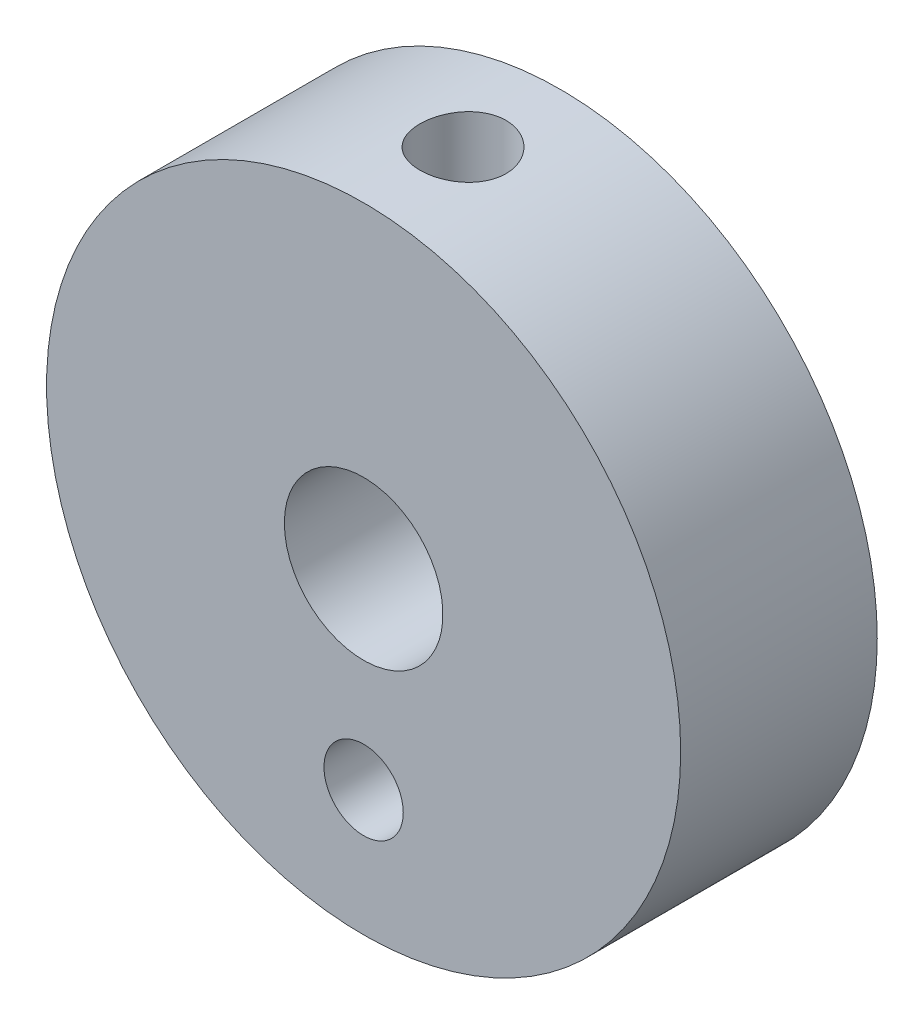
ISO-10303-21;
HEADER;
FILE_DESCRIPTION(('STEP AP214'),'2;1');
FILE_NAME('part.step','',(''),(''),'','','');
FILE_SCHEMA(('AUTOMOTIVE_DESIGN { 1 0 10303 214 1 1 1 1 }'));
ENDSEC;
DATA;
#1=APPLICATION_CONTEXT('core data for automotive mechanical design processes');
#2=APPLICATION_PROTOCOL_DEFINITION('international standard','automotive_design',2000,#1);
#3=PRODUCT_CONTEXT('',#1,'mechanical');
#4=PRODUCT('Part','Part','',(#3));
#5=PRODUCT_RELATED_PRODUCT_CATEGORY('part','',(#4));
#6=PRODUCT_DEFINITION_FORMATION('','',#4);
#7=PRODUCT_DEFINITION_CONTEXT('part definition',#1,'design');
#8=PRODUCT_DEFINITION('design','',#6,#7);
#9=PRODUCT_DEFINITION_SHAPE('','',#8);
#10=(LENGTH_UNIT() NAMED_UNIT(*) SI_UNIT(.MILLI.,.METRE.));
#11=(NAMED_UNIT(*) PLANE_ANGLE_UNIT() SI_UNIT($,.RADIAN.));
#12=(NAMED_UNIT(*) SI_UNIT($,.STERADIAN.) SOLID_ANGLE_UNIT());
#13=UNCERTAINTY_MEASURE_WITH_UNIT(LENGTH_MEASURE(1.E-05),#10,'distance_accuracy_value','');
#14=(GEOMETRIC_REPRESENTATION_CONTEXT(3) GLOBAL_UNCERTAINTY_ASSIGNED_CONTEXT((#13)) GLOBAL_UNIT_ASSIGNED_CONTEXT((#10,
#11,#12)) REPRESENTATION_CONTEXT('',''));
#15=CARTESIAN_POINT('',(0.,0.,0.));
#16=DIRECTION('',(0.,0.,1.));
#17=DIRECTION('',(1.,0.,0.));
#18=AXIS2_PLACEMENT_3D('',#15,#16,#17);
#19=CARTESIAN_POINT('',(0.,0.,7.874));
#20=DIRECTION('',(0.,0.,-1.));
#21=DIRECTION('',(-1.,0.,0.));
#22=AXIS2_PLACEMENT_3D('',#19,#20,#21);
#23=CYLINDRICAL_SURFACE('',#22,12.7);
#24=CARTESIAN_POINT('',(0.,12.7,2.16573090602914));
#25=CARTESIAN_POINT('',(0.0965396792837069,12.6999985598136,2.1657349603756));
#26=CARTESIAN_POINT('',(0.19313788835952,12.6988876348899,2.17385215836913));
#27=CARTESIAN_POINT('',(0.383641262720466,12.6945628171685,2.20610225633445));
#28=CARTESIAN_POINT('',(0.477543594319555,12.6913467904729,2.23025140791655));
#29=CARTESIAN_POINT('',(0.659870109257268,12.6831736989496,2.29383643344624));
#30=CARTESIAN_POINT('',(0.748298119159549,12.6782178667903,2.33326148632091));
#31=CARTESIAN_POINT('',(0.917267596621579,12.6671148562851,2.42625431016371));
#32=CARTESIAN_POINT('',(0.997810305988701,12.6609678659832,2.47981984930653));
#33=CARTESIAN_POINT('',(1.14925956641373,12.6481232134083,2.59994317911567));
#34=CARTESIAN_POINT('',(1.22010770382684,12.6414225724394,2.66657430571954));
#35=CARTESIAN_POINT('',(1.34965322801174,12.6282495418313,2.81077973869787));
#36=CARTESIAN_POINT('',(1.40834996346752,12.6217771644425,2.88835463128445));
#37=CARTESIAN_POINT('',(1.51214837627796,12.6097643971387,3.05263077512112));
#38=CARTESIAN_POINT('',(1.55719454736091,12.6042278518043,3.13936740361257));
#39=CARTESIAN_POINT('',(1.63205856799503,12.5947535676504,3.31926273074592));
#40=CARTESIAN_POINT('',(1.66187709959711,12.5908157572246,3.41242114154193));
#41=CARTESIAN_POINT('',(1.70526018006781,12.5850136530789,3.60190566604219));
#42=CARTESIAN_POINT('',(1.71892398419745,12.5831367024958,3.69820866049101));
#43=CARTESIAN_POINT('',(1.72991702406735,12.5816302489665,3.89175761871598));
#44=CARTESIAN_POINT('',(1.72724703362472,12.582000639552,3.98900353760296));
#45=CARTESIAN_POINT('',(1.70572959794815,12.584935437427,4.18098224821282));
#46=CARTESIAN_POINT('',(1.68699198937114,12.5874849480826,4.27572761096567));
#47=CARTESIAN_POINT('',(1.63404281811619,12.5944674746746,4.46071674221662));
#48=CARTESIAN_POINT('',(1.59983088959654,12.5989005351415,4.55096040423011));
#49=CARTESIAN_POINT('',(1.51678777622072,12.6091673807594,4.72472272345015));
#50=CARTESIAN_POINT('',(1.46790936702765,12.615005678409,4.80821853405631));
#51=CARTESIAN_POINT('',(1.3569544886235,12.6274217841589,4.96586448228241));
#52=CARTESIAN_POINT('',(1.29487730566084,12.633999632243,5.04001411414244));
#53=CARTESIAN_POINT('',(1.15868073022858,12.6472197429356,5.17750000422544));
#54=CARTESIAN_POINT('',(1.08446676266622,12.6538620914367,5.24074260364108));
#55=CARTESIAN_POINT('',(0.926427528459528,12.6664124756693,5.35388824661152));
#56=CARTESIAN_POINT('',(0.842602232141769,12.6723205091335,5.40379124898087));
#57=CARTESIAN_POINT('',(0.667643863900246,12.6827412482915,5.48884317956613));
#58=CARTESIAN_POINT('',(0.57650762619443,12.6872533453653,5.52398567466874));
#59=CARTESIAN_POINT('',(0.389552438676324,12.6943685089061,5.57844172715207));
#60=CARTESIAN_POINT('',(0.293733748979248,12.6969716812877,5.59775616274165));
#61=CARTESIAN_POINT('',(0.100942794037561,12.6999618152993,5.61988512515378));
#62=CARTESIAN_POINT('',(0.00398558366277017,12.7003660911848,5.62282856245629));
#63=CARTESIAN_POINT('',(-0.189039081756588,12.6989597896898,5.6124729958308));
#64=CARTESIAN_POINT('',(-0.285106559260473,12.6971492683712,5.59917440302865));
#65=CARTESIAN_POINT('',(-0.473240157197635,12.6915275452649,5.55681941751687));
#66=CARTESIAN_POINT('',(-0.565320497369593,12.6877242205604,5.52782505165085));
#67=CARTESIAN_POINT('',(-0.743312381030799,12.6785423551897,5.45496643583749));
#68=CARTESIAN_POINT('',(-0.829223680500661,12.6731637522553,5.41110159807366));
#69=CARTESIAN_POINT('',(-0.993010805718515,12.6613870003069,5.30943927246708));
#70=CARTESIAN_POINT('',(-1.07083485381493,12.6549828779674,5.25155907038254));
#71=CARTESIAN_POINT('',(-1.21571019775966,12.6418887019823,5.1236252567747));
#72=CARTESIAN_POINT('',(-1.28276098360848,12.6351986348193,5.05357106926911));
#73=CARTESIAN_POINT('',(-1.40464876201919,12.6222325325392,4.902707439531));
#74=CARTESIAN_POINT('',(-1.45939989179456,12.6159596109775,4.82182831858143));
#75=CARTESIAN_POINT('',(-1.55453948191124,12.6045909274511,4.65194605390712));
#76=CARTESIAN_POINT('',(-1.59492827363491,12.5994951383274,4.56294309768326));
#77=CARTESIAN_POINT('',(-1.66006015254984,12.5910794940498,4.37960786680913));
#78=CARTESIAN_POINT('',(-1.68485029701343,12.5877543021534,4.28529256534938));
#79=CARTESIAN_POINT('',(-1.71823202837945,12.583241520555,4.09378931272799));
#80=CARTESIAN_POINT('',(-1.72682451967312,12.5820538115076,3.99660152225871));
#81=CARTESIAN_POINT('',(-1.72754837816734,12.5819543727531,3.80296692543747));
#82=CARTESIAN_POINT('',(-1.71981467567275,12.5830239870332,3.70652060555757));
#83=CARTESIAN_POINT('',(-1.68839283763231,12.5872783862552,3.51631287128744));
#84=CARTESIAN_POINT('',(-1.66470471080667,12.5904631700412,3.42255145542975));
#85=CARTESIAN_POINT('',(-1.60209099032574,12.5985829781347,3.24040109551856));
#86=CARTESIAN_POINT('',(-1.56317313483387,12.6035171134843,3.15200944941365));
#87=CARTESIAN_POINT('',(-1.47121796152286,12.6145809648257,2.98298894176784));
#88=CARTESIAN_POINT('',(-1.41818033942691,12.6207107065817,2.90236024756725));
#89=CARTESIAN_POINT('',(-1.29899473681643,12.63353566248,2.75046627524804));
#90=CARTESIAN_POINT('',(-1.23274641265286,12.6402349644239,2.67928007114372));
#91=CARTESIAN_POINT('',(-1.08923107275939,12.6534089120958,2.54898522909935));
#92=CARTESIAN_POINT('',(-1.01196147985039,12.6598835048369,2.4898794238891));
#93=CARTESIAN_POINT('',(-0.848193382200404,12.6719112198954,2.38519152220324));
#94=CARTESIAN_POINT('',(-0.761654947550799,12.6774600685591,2.33967142086408));
#95=CARTESIAN_POINT('',(-0.582131298261338,12.686968539204,2.26387709460759));
#96=CARTESIAN_POINT('',(-0.489153073114221,12.6909298534877,2.23358662616906));
#97=CARTESIAN_POINT('',(-0.329766287705411,12.6958830458208,2.19620471935263));
#98=CARTESIAN_POINT('',(-0.264354477926289,12.6974192135148,2.18479389213324));
#99=CARTESIAN_POINT('',(-0.132637650698258,12.6994781806546,2.16955562797384));
#100=CARTESIAN_POINT('',(-0.0663326415891031,12.7000009895555,2.16572812027813));
#101=CARTESIAN_POINT('',(0.,12.7,2.16573090602914));
#102=B_SPLINE_CURVE_WITH_KNOTS('',3,(#24,#25,#26,#27,#28,#29,#30,#31,#32,#33,#34,#35,#36,#37,
#38,#39,#40,#41,#42,#43,#44,#45,#46,#47,#48,#49,#50,#51,#52,#53,#54,#55,#56,#57,#58,#59,#60,#61,
#62,#63,#64,#65,#66,#67,#68,#69,#70,#71,#72,#73,#74,#75,#76,#77,#78,#79,#80,#81,#82,#83,#84,#85,
#86,#87,#88,#89,#90,#91,#92,#93,#94,#95,#96,#97,#98,#99,#100,#101),.UNSPECIFIED.,.T.,.F.,(4,2,2,
2,2,2,2,2,2,2,2,2,2,2,2,2,2,2,2,2,2,2,2,2,2,2,2,2,2,2,2,2,2,2,2,2,2,2,4),(0.,0.289376707113219,
0.579047204571122,0.868512880611045,1.15793289690833,1.44902646878786,1.74013563926629,
2.03241311448565,2.32467749735381,2.61513670763537,2.90558215745472,3.19405783577439,
3.48254033455248,3.77196186658289,4.06139905367667,4.35320970564024,4.64502125854675,
4.93695986086231,5.22888226407107,5.51850268716948,5.80811577941214,6.09659264043311,
6.38508090601715,6.67531511265751,6.96556305475863,7.2577782376138,7.54998667774762,
7.84130931661261,8.13261568908139,8.42152394522899,8.71043204346843,8.99919353887011,
9.2879612575005,9.57901216815857,9.87013124917066,10.1625591555123,10.4546745008618,
10.6535077748175,10.8523391935626),.UNSPECIFIED.);
#103=CARTESIAN_POINT('',(0.,12.7,2.16573090602914));
#104=VERTEX_POINT('',#103);
#105=EDGE_CURVE('E42',#104,#104,#102,.T.);
#106=ORIENTED_EDGE('',*,*,#105,.T.);
#107=EDGE_LOOP('',(#106));
#108=FACE_BOUND('',#107,.T.);
#109=CARTESIAN_POINT('',(0.,0.,7.874));
#110=DIRECTION('',(0.,0.,1.));
#111=DIRECTION('',(1.,0.,0.));
#112=AXIS2_PLACEMENT_3D('',#109,#110,#111);
#113=CIRCLE('',#112,12.7);
#114=CARTESIAN_POINT('',(12.7,0.,7.874));
#115=VERTEX_POINT('',#114);
#116=EDGE_CURVE('E10',#115,#115,#113,.T.);
#117=ORIENTED_EDGE('',*,*,#116,.F.);
#118=EDGE_LOOP('',(#117));
#119=FACE_BOUND('',#118,.T.);
#120=CARTESIAN_POINT('',(0.,0.,0.));
#121=DIRECTION('',(0.,0.,1.));
#122=DIRECTION('',(1.,0.,0.));
#123=AXIS2_PLACEMENT_3D('',#120,#121,#122);
#124=CIRCLE('',#123,12.7);
#125=CARTESIAN_POINT('',(12.7,0.,0.));
#126=VERTEX_POINT('',#125);
#127=EDGE_CURVE('E50',#126,#126,#124,.T.);
#128=ORIENTED_EDGE('',*,*,#127,.T.);
#129=EDGE_LOOP('',(#128));
#130=FACE_BOUND('',#129,.T.);
#131=ADVANCED_FACE('F38',(#108,#119,#130),#23,.T.);
#132=CARTESIAN_POINT('',(0.,0.,7.874));
#133=DIRECTION('',(0.,0.,1.));
#134=DIRECTION('',(1.,0.,0.));
#135=AXIS2_PLACEMENT_3D('',#132,#133,#134);
#136=PLANE('',#135);
#137=CARTESIAN_POINT('',(0.,-7.66966803092312,7.874));
#138=DIRECTION('',(0.,0.,1.));
#139=DIRECTION('',(1.,0.,0.));
#140=AXIS2_PLACEMENT_3D('',#137,#138,#139);
#141=CIRCLE('',#140,1.5875);
#142=CARTESIAN_POINT('',(1.5875,-7.66966803092312,7.874));
#143=VERTEX_POINT('',#142);
#144=EDGE_CURVE('E65',#143,#143,#141,.T.);
#145=ORIENTED_EDGE('',*,*,#144,.F.);
#146=EDGE_LOOP('',(#145));
#147=FACE_BOUND('',#146,.T.);
#148=CARTESIAN_POINT('',(0.,0.,7.874));
#149=DIRECTION('',(0.,0.,-1.));
#150=DIRECTION('',(-1.,0.,0.));
#151=AXIS2_PLACEMENT_3D('',#148,#149,#150);
#152=CIRCLE('',#151,3.175);
#153=CARTESIAN_POINT('',(-3.175,0.,7.874));
#154=VERTEX_POINT('',#153);
#155=EDGE_CURVE('E55',#154,#154,#152,.T.);
#156=ORIENTED_EDGE('',*,*,#155,.T.);
#157=EDGE_LOOP('',(#156));
#158=FACE_BOUND('',#157,.T.);
#159=ORIENTED_EDGE('',*,*,#116,.T.);
#160=EDGE_LOOP('',(#159));
#161=FACE_BOUND('',#160,.T.);
#162=ADVANCED_FACE('F94',(#147,#158,#161),#136,.T.);
#163=CARTESIAN_POINT('',(0.,0.,0.));
#164=DIRECTION('',(0.,0.,1.));
#165=DIRECTION('',(1.,0.,0.));
#166=AXIS2_PLACEMENT_3D('',#163,#164,#165);
#167=PLANE('',#166);
#168=CARTESIAN_POINT('',(0.,-7.66966803092312,0.));
#169=DIRECTION('',(0.,0.,1.));
#170=DIRECTION('',(1.,0.,0.));
#171=AXIS2_PLACEMENT_3D('',#168,#169,#170);
#172=CIRCLE('',#171,1.5875);
#173=CARTESIAN_POINT('',(1.5875,-7.66966803092312,0.));
#174=VERTEX_POINT('',#173);
#175=EDGE_CURVE('E62',#174,#174,#172,.T.);
#176=ORIENTED_EDGE('',*,*,#175,.T.);
#177=EDGE_LOOP('',(#176));
#178=FACE_BOUND('',#177,.T.);
#179=CARTESIAN_POINT('',(0.,0.,0.));
#180=DIRECTION('',(0.,0.,-1.));
#181=DIRECTION('',(-1.,0.,0.));
#182=AXIS2_PLACEMENT_3D('',#179,#180,#181);
#183=CIRCLE('',#182,3.175);
#184=CARTESIAN_POINT('',(-3.175,0.,0.));
#185=VERTEX_POINT('',#184);
#186=EDGE_CURVE('E59',#185,#185,#183,.T.);
#187=ORIENTED_EDGE('',*,*,#186,.F.);
#188=EDGE_LOOP('',(#187));
#189=FACE_BOUND('',#188,.T.);
#190=ORIENTED_EDGE('',*,*,#127,.F.);
#191=EDGE_LOOP('',(#190));
#192=FACE_BOUND('',#191,.T.);
#193=ADVANCED_FACE('F89',(#178,#189,#192),#167,.F.);
#194=CARTESIAN_POINT('',(0.,0.,0.));
#195=DIRECTION('',(0.,0.,-1.));
#196=DIRECTION('',(-1.,0.,0.));
#197=AXIS2_PLACEMENT_3D('',#194,#195,#196);
#198=CYLINDRICAL_SURFACE('',#197,3.175);
#199=CARTESIAN_POINT('',(0.,3.175,2.16573090602914));
#200=CARTESIAN_POINT('',(-0.0898167329870316,3.17499484200097,2.16573664286881));
#201=CARTESIAN_POINT('',(-0.179710396777628,3.17114975925812,2.17277736778239));
#202=CARTESIAN_POINT('',(-0.356779036000195,3.15614659634562,2.20059876483858));
#203=CARTESIAN_POINT('',(-0.443949931988855,3.14497804708023,2.22139910710685));
#204=CARTESIAN_POINT('',(-0.612755080544285,3.11648141632095,2.27565532315896));
#205=CARTESIAN_POINT('',(-0.694410411602406,3.09917857401842,2.30905937537853));
#206=CARTESIAN_POINT('',(-0.850799732084927,3.05994681948074,2.38727092327057));
#207=CARTESIAN_POINT('',(-0.925533518541812,3.03801777164842,2.43207875320333));
#208=CARTESIAN_POINT('',(-1.07165787157549,2.98973072895781,2.53524788418843));
#209=CARTESIAN_POINT('',(-1.14247785066843,2.96317321502845,2.59432234577014));
#210=CARTESIAN_POINT('',(-1.27374384775617,2.90916641429737,2.7227842978788));
#211=CARTESIAN_POINT('',(-1.33418038986057,2.88171633982664,2.79218110193455));
#212=CARTESIAN_POINT('',(-1.44881148181351,2.82595304844433,2.9472416297659));
#213=CARTESIAN_POINT('',(-1.5018524704536,2.79780929477208,3.03382697762242));
#214=CARTESIAN_POINT('',(-1.59241122402043,2.7472815216645,3.21632275833909));
#215=CARTESIAN_POINT('',(-1.62994117568031,2.72489298571024,3.31222579700832));
#216=CARTESIAN_POINT('',(-1.68576600124416,2.69069454210209,3.50461115755863));
#217=CARTESIAN_POINT('',(-1.70512359412162,2.67830711291766,3.60067646287665));
#218=CARTESIAN_POINT('',(-1.72721683304719,2.66412109265389,3.79541794000686));
#219=CARTESIAN_POINT('',(-1.72997524162546,2.66230800104692,3.89409034997873));
#220=CARTESIAN_POINT('',(-1.71956662107673,2.66903051227905,4.07546448029072));
#221=CARTESIAN_POINT('',(-1.70869604645259,2.67607428080865,4.15836862115422));
#222=CARTESIAN_POINT('',(-1.67539045912866,2.69704944144968,4.32091794139545));
#223=CARTESIAN_POINT('',(-1.65295041225414,2.71098383173981,4.40056168579384));
#224=CARTESIAN_POINT('',(-1.59682922869677,2.74442012851359,4.55654528167993));
#225=CARTESIAN_POINT('',(-1.56291239931999,2.764037413562,4.63277439762505));
#226=CARTESIAN_POINT('',(-1.48500048339766,2.80666515066853,4.77885075068145));
#227=CARTESIAN_POINT('',(-1.44100099769844,2.82967708227558,4.8486951834351));
#228=CARTESIAN_POINT('',(-1.33631133979447,2.88076103596007,4.99132698933518));
#229=CARTESIAN_POINT('',(-1.27409486773378,2.90906693011305,5.06291452985758));
#230=CARTESIAN_POINT('',(-1.13855614581347,2.96474061704806,5.19519210277884));
#231=CARTESIAN_POINT('',(-1.06522665805137,2.99210778408684,5.25587497625748));
#232=CARTESIAN_POINT('',(-0.90366021524971,3.04494539658694,5.3683667006627));
#233=CARTESIAN_POINT('',(-0.814767962766243,3.07018080541161,5.41935428042328));
#234=CARTESIAN_POINT('',(-0.62796149906438,3.11375255101697,5.50520329664931));
#235=CARTESIAN_POINT('',(-0.530055717587374,3.13209525409142,5.5400796207799));
#236=CARTESIAN_POINT('',(-0.337632448212784,3.15835019333608,5.58944604324847));
#237=CARTESIAN_POINT('',(-0.243631771803307,3.16706671226616,5.60551634739717));
#238=CARTESIAN_POINT('',(-0.0538862781183469,3.17595961869238,5.62190940978047));
#239=CARTESIAN_POINT('',(0.041857427537954,3.17614127075225,5.62224187559015));
#240=CARTESIAN_POINT('',(0.222630300123889,3.1683542676247,5.60789125484244));
#241=CARTESIAN_POINT('',(0.307811973389665,3.16115964711463,5.59463421519099));
#242=CARTESIAN_POINT('',(0.474526421749048,3.14046289285925,5.55587111378451));
#243=CARTESIAN_POINT('',(0.556058823079064,3.12696011463607,5.53036380046324));
#244=CARTESIAN_POINT('',(0.715436921893435,3.09443863657224,5.4673794076155));
#245=CARTESIAN_POINT('',(0.793151670088337,3.07529823396287,5.42963614986701));
#246=CARTESIAN_POINT('',(0.941355668884582,3.03321912282633,5.34359300770637));
#247=CARTESIAN_POINT('',(1.01184219665667,3.01027899141093,5.29528916648593));
#248=CARTESIAN_POINT('',(1.15187925533852,2.95971846730473,5.18339216541462));
#249=CARTESIAN_POINT('',(1.22046654048611,2.93186099072405,5.11869957272394));
#250=CARTESIAN_POINT('',(1.34632605581709,2.87624333035612,4.97897000533507));
#251=CARTESIAN_POINT('',(1.40358695617025,2.84848327100078,4.90392279894872));
#252=CARTESIAN_POINT('',(1.5093040607395,2.79399702964103,4.73881633799676));
#253=CARTESIAN_POINT('',(1.55679695839787,2.7674988325876,4.64805755849094));
#254=CARTESIAN_POINT('',(1.63536975293384,2.7218154792425,4.45801300320912));
#255=CARTESIAN_POINT('',(1.66647342303255,2.70261974175344,4.35873982248839));
#256=CARTESIAN_POINT('',(1.70828382295166,2.67636880112584,4.16468371591115));
#257=CARTESIAN_POINT('',(1.72068332127367,2.668312524142,4.07040644250791));
#258=CARTESIAN_POINT('',(1.72975688521703,2.66244374147667,3.88080883842567));
#259=CARTESIAN_POINT('',(1.72644337296087,2.66462314383421,3.78548939111414));
#260=CARTESIAN_POINT('',(1.70582759803792,2.67785061366613,3.60980611350665));
#261=CARTESIAN_POINT('',(1.69041123113613,2.6877017050996,3.52911652372982));
#262=CARTESIAN_POINT('',(1.64867033738275,2.71350503746821,3.37163871786887));
#263=CARTESIAN_POINT('',(1.6223415022716,2.72945968790627,3.29485205612356));
#264=CARTESIAN_POINT('',(1.55774844297324,2.76686018244403,3.14196072545782));
#265=CARTESIAN_POINT('',(1.51884069270723,2.78858706965438,3.06619911834363));
#266=CARTESIAN_POINT('',(1.43081457938664,2.83476013423946,2.92177138891052));
#267=CARTESIAN_POINT('',(1.38169075459495,2.85920776291876,2.8531090915563));
#268=CARTESIAN_POINT('',(1.26590027631125,2.91252000323831,2.71390056767125));
#269=CARTESIAN_POINT('',(1.19770097359166,2.94148987707649,2.64466241145858));
#270=CARTESIAN_POINT('',(1.05011316478986,2.99735105334147,2.5181837775846));
#271=CARTESIAN_POINT('',(0.970716985738054,3.02424091064674,2.46095159481558));
#272=CARTESIAN_POINT('',(0.799648332324609,3.07398126546603,2.35865079477796));
#273=CARTESIAN_POINT('',(0.707672838408699,3.09668166594536,2.31401159272899));
#274=CARTESIAN_POINT('',(0.51599122220753,3.13430112883055,2.24144375937207));
#275=CARTESIAN_POINT('',(0.416306007716468,3.14924044322134,2.21347160827004));
#276=CARTESIAN_POINT('',(0.262876021187139,3.16452941008055,2.18503864699766));
#277=CARTESIAN_POINT('',(0.210650818113224,3.16844092250735,2.1778133065037));
#278=CARTESIAN_POINT('',(0.105625946387149,3.17367773046768,2.16815775608641));
#279=CARTESIAN_POINT('',(0.0528262794477231,3.17500303370974,2.16572753187062));
#280=CARTESIAN_POINT('',(0.,3.175,2.16573090602914));
#281=B_SPLINE_CURVE_WITH_KNOTS('',3,(#199,#200,#201,#202,#203,#204,#205,#206,#207,#208,#209,
#210,#211,#212,#213,#214,#215,#216,#217,#218,#219,#220,#221,#222,#223,#224,#225,#226,#227,#228,
#229,#230,#231,#232,#233,#234,#235,#236,#237,#238,#239,#240,#241,#242,#243,#244,#245,#246,#247,
#248,#249,#250,#251,#252,#253,#254,#255,#256,#257,#258,#259,#260,#261,#262,#263,#264,#265,#266,
#267,#268,#269,#270,#271,#272,#273,#274,#275,#276,#277,#278,#279,#280),.UNSPECIFIED.,.T.,.F.,(4,
2,2,2,2,2,2,2,2,2,2,2,2,2,2,2,2,2,2,2,2,2,2,2,2,2,2,2,2,2,2,2,2,2,2,2,2,2,2,2,4),(0.,
0.269237366741942,0.538860457206647,0.807386833520667,1.07592108161609,1.36266948063225,
1.64967819109357,1.96419704531974,2.27846831600627,2.57294341145818,2.86701459980267,
3.11756500584303,3.36822452493013,3.62438021478772,3.88064788119477,4.17633401900356,
4.472213571347,4.78711425412074,5.10172336681182,5.38739145348505,5.67288332913717,
5.93120440761277,6.18955188343687,6.45394594831551,6.71843924587247,7.01214559552771,
7.30614427141864,7.62186818462157,7.937132858264,8.22166481147844,8.50597186181723,
8.75310154925952,9.00032889696819,9.26301971807987,9.52585134216128,9.82874467547087,
10.131846592656,10.4442934112149,10.7559207748692,10.9142749065924,11.07262856632),.UNSPECIFIED.);
#282=CARTESIAN_POINT('',(0.,3.175,2.16573090602914));
#283=VERTEX_POINT('',#282);
#284=EDGE_CURVE('E68',#283,#283,#281,.T.);
#285=ORIENTED_EDGE('',*,*,#284,.T.);
#286=EDGE_LOOP('',(#285));
#287=FACE_BOUND('',#286,.T.);
#288=ORIENTED_EDGE('',*,*,#155,.F.);
#289=EDGE_LOOP('',(#288));
#290=FACE_BOUND('',#289,.T.);
#291=ORIENTED_EDGE('',*,*,#186,.T.);
#292=EDGE_LOOP('',(#291));
#293=FACE_BOUND('',#292,.T.);
#294=ADVANCED_FACE('F74',(#287,#290,#293),#198,.F.);
#295=CARTESIAN_POINT('',(0.,-7.66966803092312,7.874));
#296=DIRECTION('',(0.,0.,1.));
#297=DIRECTION('',(1.,0.,0.));
#298=AXIS2_PLACEMENT_3D('',#295,#296,#297);
#299=CYLINDRICAL_SURFACE('',#298,1.5875);
#300=ORIENTED_EDGE('',*,*,#175,.F.);
#301=EDGE_LOOP('',(#300));
#302=FACE_BOUND('',#301,.T.);
#303=ORIENTED_EDGE('',*,*,#144,.T.);
#304=EDGE_LOOP('',(#303));
#305=FACE_BOUND('',#304,.T.);
#306=ADVANCED_FACE('F81',(#302,#305),#299,.F.);
#307=CARTESIAN_POINT('',(0.,0.,3.89293090602914));
#308=DIRECTION('',(0.,-1.,0.));
#309=DIRECTION('',(0.,0.,-1.));
#310=AXIS2_PLACEMENT_3D('',#307,#308,#309);
#311=CYLINDRICAL_SURFACE('',#310,1.72719999999999);
#312=ORIENTED_EDGE('',*,*,#105,.F.);
#313=EDGE_LOOP('',(#312));
#314=FACE_BOUND('',#313,.T.);
#315=ORIENTED_EDGE('',*,*,#284,.F.);
#316=EDGE_LOOP('',(#315));
#317=FACE_BOUND('',#316,.T.);
#318=ADVANCED_FACE('F78',(#314,#317),#311,.F.);
#319=CLOSED_SHELL('',(#131,#162,#193,#294,#306,#318));
#320=MANIFOLD_SOLID_BREP('B2',#319);
#321=ADVANCED_BREP_SHAPE_REPRESENTATION('',(#18,#320),#14);
#322=SHAPE_DEFINITION_REPRESENTATION(#9,#321);
ENDSEC;
END-ISO-10303-21;
